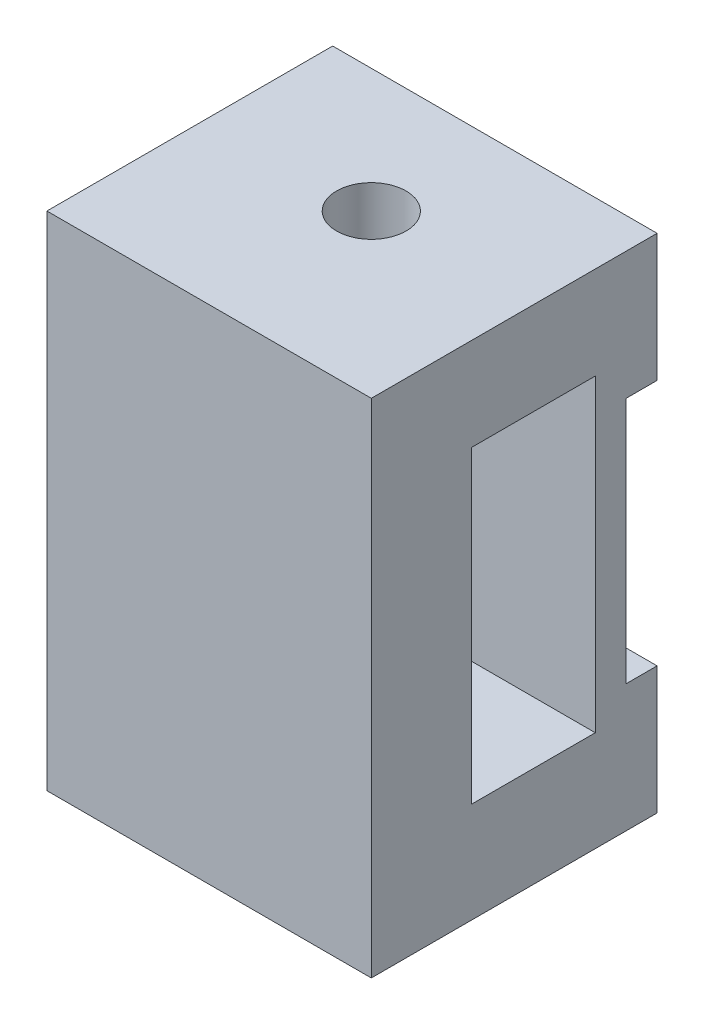
ISO-10303-21;
HEADER;
FILE_DESCRIPTION(('STEP AP214'),'2;1');
FILE_NAME('part.step','',(''),(''),'','','');
FILE_SCHEMA(('AUTOMOTIVE_DESIGN { 1 0 10303 214 1 1 1 1 }'));
ENDSEC;
DATA;
#1=APPLICATION_CONTEXT('core data for automotive mechanical design processes');
#2=APPLICATION_PROTOCOL_DEFINITION('international standard','automotive_design',2000,#1);
#3=PRODUCT_CONTEXT('',#1,'mechanical');
#4=PRODUCT('Part','Part','',(#3));
#5=PRODUCT_RELATED_PRODUCT_CATEGORY('part','',(#4));
#6=PRODUCT_DEFINITION_FORMATION('','',#4);
#7=PRODUCT_DEFINITION_CONTEXT('part definition',#1,'design');
#8=PRODUCT_DEFINITION('design','',#6,#7);
#9=PRODUCT_DEFINITION_SHAPE('','',#8);
#10=(LENGTH_UNIT() NAMED_UNIT(*) SI_UNIT(.MILLI.,.METRE.));
#11=(NAMED_UNIT(*) PLANE_ANGLE_UNIT() SI_UNIT($,.RADIAN.));
#12=(NAMED_UNIT(*) SI_UNIT($,.STERADIAN.) SOLID_ANGLE_UNIT());
#13=UNCERTAINTY_MEASURE_WITH_UNIT(LENGTH_MEASURE(1.E-05),#10,'distance_accuracy_value','');
#14=(GEOMETRIC_REPRESENTATION_CONTEXT(3) GLOBAL_UNCERTAINTY_ASSIGNED_CONTEXT((#13)) GLOBAL_UNIT_ASSIGNED_CONTEXT((#10,
#11,#12)) REPRESENTATION_CONTEXT('',''));
#15=CARTESIAN_POINT('',(0.,0.,0.));
#16=DIRECTION('',(0.,0.,1.));
#17=DIRECTION('',(1.,0.,0.));
#18=AXIS2_PLACEMENT_3D('',#15,#16,#17);
#19=CARTESIAN_POINT('',(-21.,-53.,-16.));
#20=DIRECTION('',(0.,0.,1.));
#21=DIRECTION('',(1.,0.,0.));
#22=AXIS2_PLACEMENT_3D('',#19,#20,#21);
#23=PLANE('',#22);
#24=DIRECTION('',(1.,0.,0.));
#25=VECTOR('',#24,1.);
#26=CARTESIAN_POINT('',(-21.,-36.5,-15.9999999999998));
#27=LINE('',#26,#25);
#28=CARTESIAN_POINT('',(-21.,-36.5,-15.9999999999998));
#29=VERTEX_POINT('',#28);
#30=CARTESIAN_POINT('',(21.,-36.5,-16.));
#31=VERTEX_POINT('',#30);
#32=EDGE_CURVE('E159',#29,#31,#27,.T.);
#33=ORIENTED_EDGE('',*,*,#32,.T.);
#34=DIRECTION('',(0.,1.,0.));
#35=VECTOR('',#34,1.);
#36=CARTESIAN_POINT('',(21.,-53.,-16.));
#37=LINE('',#36,#35);
#38=CARTESIAN_POINT('',(21.,-53.,-16.));
#39=VERTEX_POINT('',#38);
#40=EDGE_CURVE('E58',#39,#31,#37,.T.);
#41=ORIENTED_EDGE('',*,*,#40,.F.);
#42=DIRECTION('',(1.,0.,0.));
#43=VECTOR('',#42,1.);
#44=CARTESIAN_POINT('',(-21.,-53.,-16.));
#45=LINE('',#44,#43);
#46=CARTESIAN_POINT('',(-21.,-53.,-16.));
#47=VERTEX_POINT('',#46);
#48=EDGE_CURVE('E162',#47,#39,#45,.T.);
#49=ORIENTED_EDGE('',*,*,#48,.F.);
#50=DIRECTION('',(0.,1.,0.));
#51=VECTOR('',#50,1.);
#52=CARTESIAN_POINT('',(-21.,-53.,-16.));
#53=LINE('',#52,#51);
#54=EDGE_CURVE('E169',#47,#29,#53,.T.);
#55=ORIENTED_EDGE('',*,*,#54,.T.);
#56=EDGE_LOOP('',(#33,#41,#49,#55));
#57=FACE_BOUND('',#56,.T.);
#58=ADVANCED_FACE('F36',(#57),#23,.F.);
#59=CARTESIAN_POINT('',(0.,0.,0.));
#60=DIRECTION('',(0.,1.,0.));
#61=DIRECTION('',(0.,0.,1.));
#62=AXIS2_PLACEMENT_3D('',#59,#60,#61);
#63=PLANE('',#62);
#64=CARTESIAN_POINT('',(0.,0.,0.));
#65=DIRECTION('',(0.,1.,0.));
#66=DIRECTION('',(0.,0.,1.));
#67=AXIS2_PLACEMENT_3D('',#64,#65,#66);
#68=CIRCLE('',#67,4.5);
#69=CARTESIAN_POINT('',(0.,0.,4.5));
#70=VERTEX_POINT('',#69);
#71=EDGE_CURVE('E180',#70,#70,#68,.T.);
#72=ORIENTED_EDGE('',*,*,#71,.T.);
#73=EDGE_LOOP('',(#72));
#74=FACE_BOUND('',#73,.T.);
#75=DIRECTION('',(1.,0.,0.));
#76=VECTOR('',#75,1.);
#77=CARTESIAN_POINT('',(-21.,0.,8.));
#78=LINE('',#77,#76);
#79=CARTESIAN_POINT('',(-21.,0.,8.));
#80=VERTEX_POINT('',#79);
#81=CARTESIAN_POINT('',(21.,0.,8.));
#82=VERTEX_POINT('',#81);
#83=EDGE_CURVE('E203',#80,#82,#78,.T.);
#84=ORIENTED_EDGE('',*,*,#83,.F.);
#85=DIRECTION('',(0.,0.,1.));
#86=VECTOR('',#85,1.);
#87=CARTESIAN_POINT('',(-21.,0.,-21.));
#88=LINE('',#87,#86);
#89=CARTESIAN_POINT('',(-21.,0.,-8.));
#90=VERTEX_POINT('',#89);
#91=EDGE_CURVE('E224',#90,#80,#88,.T.);
#92=ORIENTED_EDGE('',*,*,#91,.F.);
#93=DIRECTION('',(-1.,0.,0.));
#94=VECTOR('',#93,1.);
#95=CARTESIAN_POINT('',(-21.,0.,-8.));
#96=LINE('',#95,#94);
#97=CARTESIAN_POINT('',(21.,0.,-8.));
#98=VERTEX_POINT('',#97);
#99=EDGE_CURVE('E205',#98,#90,#96,.T.);
#100=ORIENTED_EDGE('',*,*,#99,.F.);
#101=DIRECTION('',(0.,0.,-1.));
#102=VECTOR('',#101,1.);
#103=CARTESIAN_POINT('',(21.,0.,-21.));
#104=LINE('',#103,#102);
#105=EDGE_CURVE('E219',#82,#98,#104,.T.);
#106=ORIENTED_EDGE('',*,*,#105,.F.);
#107=EDGE_LOOP('',(#84,#92,#100,#106));
#108=FACE_BOUND('',#107,.T.);
#109=ADVANCED_FACE('F265',(#74,#108),#63,.F.);
#110=CARTESIAN_POINT('',(21.,12.,-21.));
#111=DIRECTION('',(-1.,0.,0.));
#112=DIRECTION('',(0.,0.,1.));
#113=AXIS2_PLACEMENT_3D('',#110,#111,#112);
#114=PLANE('',#113);
#115=DIRECTION('',(0.,1.,0.));
#116=VECTOR('',#115,1.);
#117=CARTESIAN_POINT('',(21.,-36.5,-12.));
#118=LINE('',#117,#116);
#119=CARTESIAN_POINT('',(21.,-36.5,-12.));
#120=VERTEX_POINT('',#119);
#121=CARTESIAN_POINT('',(21.,-4.5,-12.));
#122=VERTEX_POINT('',#121);
#123=EDGE_CURVE('E150',#120,#122,#118,.T.);
#124=ORIENTED_EDGE('',*,*,#123,.T.);
#125=DIRECTION('',(0.,0.,1.));
#126=VECTOR('',#125,1.);
#127=CARTESIAN_POINT('',(21.,-4.5,-16.));
#128=LINE('',#127,#126);
#129=CARTESIAN_POINT('',(21.,-4.5,-16.));
#130=VERTEX_POINT('',#129);
#131=EDGE_CURVE('E141',#130,#122,#128,.T.);
#132=ORIENTED_EDGE('',*,*,#131,.F.);
#133=CARTESIAN_POINT('',(21.,12.,-16.));
#134=VERTEX_POINT('',#133);
#135=EDGE_CURVE('E168',#130,#134,#37,.T.);
#136=ORIENTED_EDGE('',*,*,#135,.T.);
#137=DIRECTION('',(0.,0.,-1.));
#138=VECTOR('',#137,1.);
#139=CARTESIAN_POINT('',(21.,12.,-21.));
#140=LINE('',#139,#138);
#141=CARTESIAN_POINT('',(21.,12.,21.));
#142=VERTEX_POINT('',#141);
#143=EDGE_CURVE('E220',#142,#134,#140,.T.);
#144=ORIENTED_EDGE('',*,*,#143,.F.);
#145=DIRECTION('',(0.,-1.,0.));
#146=VECTOR('',#145,1.);
#147=CARTESIAN_POINT('',(21.,12.,21.));
#148=LINE('',#147,#146);
#149=CARTESIAN_POINT('',(21.,-53.,21.));
#150=VERTEX_POINT('',#149);
#151=EDGE_CURVE('E44',#142,#150,#148,.T.);
#152=ORIENTED_EDGE('',*,*,#151,.T.);
#153=DIRECTION('',(0.,0.,1.));
#154=VECTOR('',#153,1.);
#155=CARTESIAN_POINT('',(21.,-53.,21.));
#156=LINE('',#155,#154);
#157=EDGE_CURVE('E187',#39,#150,#156,.T.);
#158=ORIENTED_EDGE('',*,*,#157,.F.);
#159=ORIENTED_EDGE('',*,*,#40,.T.);
#160=DIRECTION('',(0.,0.,1.));
#161=VECTOR('',#160,1.);
#162=CARTESIAN_POINT('',(21.,-36.5,-15.9999999999998));
#163=LINE('',#162,#161);
#164=EDGE_CURVE('E51',#31,#120,#163,.T.);
#165=ORIENTED_EDGE('',*,*,#164,.T.);
#166=EDGE_LOOP('',(#124,#132,#136,#144,#152,#158,#159,#165));
#167=FACE_BOUND('',#166,.T.);
#168=DIRECTION('',(0.,1.,0.));
#169=VECTOR('',#168,1.);
#170=CARTESIAN_POINT('',(21.,-40.,-8.));
#171=LINE('',#170,#169);
#172=CARTESIAN_POINT('',(21.,-40.,-7.99999999999999));
#173=VERTEX_POINT('',#172);
#174=EDGE_CURVE('E216',#173,#98,#171,.T.);
#175=ORIENTED_EDGE('',*,*,#174,.F.);
#176=DIRECTION('',(0.,0.,1.));
#177=VECTOR('',#176,1.);
#178=CARTESIAN_POINT('',(21.,-40.,21.));
#179=LINE('',#178,#177);
#180=CARTESIAN_POINT('',(21.,-40.,8.));
#181=VERTEX_POINT('',#180);
#182=EDGE_CURVE('E188',#173,#181,#179,.T.);
#183=ORIENTED_EDGE('',*,*,#182,.T.);
#184=DIRECTION('',(0.,1.,0.));
#185=VECTOR('',#184,1.);
#186=CARTESIAN_POINT('',(21.,-40.,8.));
#187=LINE('',#186,#185);
#188=EDGE_CURVE('E199',#181,#82,#187,.T.);
#189=ORIENTED_EDGE('',*,*,#188,.T.);
#190=ORIENTED_EDGE('',*,*,#105,.T.);
#191=EDGE_LOOP('',(#175,#183,#189,#190));
#192=FACE_BOUND('',#191,.T.);
#193=ADVANCED_FACE('F38',(#167,#192),#114,.F.);
#194=CARTESIAN_POINT('',(-21.,12.,-21.));
#195=DIRECTION('',(1.,0.,0.));
#196=DIRECTION('',(0.,0.,-1.));
#197=AXIS2_PLACEMENT_3D('',#194,#195,#196);
#198=PLANE('',#197);
#199=CARTESIAN_POINT('',(-21.,-4.5,-16.));
#200=VERTEX_POINT('',#199);
#201=CARTESIAN_POINT('',(-21.,12.,-16.));
#202=VERTEX_POINT('',#201);
#203=EDGE_CURVE('E148',#200,#202,#53,.T.);
#204=ORIENTED_EDGE('',*,*,#203,.F.);
#205=DIRECTION('',(0.,0.,1.));
#206=VECTOR('',#205,1.);
#207=CARTESIAN_POINT('',(-21.,-4.5,-16.));
#208=LINE('',#207,#206);
#209=CARTESIAN_POINT('',(-21.,-4.5,-12.));
#210=VERTEX_POINT('',#209);
#211=EDGE_CURVE('E135',#200,#210,#208,.T.);
#212=ORIENTED_EDGE('',*,*,#211,.T.);
#213=DIRECTION('',(0.,1.,0.));
#214=VECTOR('',#213,1.);
#215=CARTESIAN_POINT('',(-21.,-36.5,-12.));
#216=LINE('',#215,#214);
#217=CARTESIAN_POINT('',(-21.,-36.5,-12.));
#218=VERTEX_POINT('',#217);
#219=EDGE_CURVE('E124',#218,#210,#216,.T.);
#220=ORIENTED_EDGE('',*,*,#219,.F.);
#221=DIRECTION('',(0.,0.,1.));
#222=VECTOR('',#221,1.);
#223=CARTESIAN_POINT('',(-21.,-36.5,-15.9999999999998));
#224=LINE('',#223,#222);
#225=EDGE_CURVE('E134',#29,#218,#224,.T.);
#226=ORIENTED_EDGE('',*,*,#225,.F.);
#227=ORIENTED_EDGE('',*,*,#54,.F.);
#228=DIRECTION('',(0.,0.,-1.));
#229=VECTOR('',#228,1.);
#230=CARTESIAN_POINT('',(-21.,-53.,21.));
#231=LINE('',#230,#229);
#232=CARTESIAN_POINT('',(-21.,-53.,21.));
#233=VERTEX_POINT('',#232);
#234=EDGE_CURVE('E184',#233,#47,#231,.T.);
#235=ORIENTED_EDGE('',*,*,#234,.F.);
#236=DIRECTION('',(0.,-1.,0.));
#237=VECTOR('',#236,1.);
#238=CARTESIAN_POINT('',(-21.,12.,21.));
#239=LINE('',#238,#237);
#240=CARTESIAN_POINT('',(-21.,12.,21.));
#241=VERTEX_POINT('',#240);
#242=EDGE_CURVE('E11',#241,#233,#239,.T.);
#243=ORIENTED_EDGE('',*,*,#242,.F.);
#244=DIRECTION('',(0.,0.,1.));
#245=VECTOR('',#244,1.);
#246=CARTESIAN_POINT('',(-21.,12.,-21.));
#247=LINE('',#246,#245);
#248=EDGE_CURVE('E223',#202,#241,#247,.T.);
#249=ORIENTED_EDGE('',*,*,#248,.F.);
#250=EDGE_LOOP('',(#204,#212,#220,#226,#227,#235,#243,#249));
#251=FACE_BOUND('',#250,.T.);
#252=DIRECTION('',(0.,0.,-1.));
#253=VECTOR('',#252,1.);
#254=CARTESIAN_POINT('',(-21.,-40.,21.));
#255=LINE('',#254,#253);
#256=CARTESIAN_POINT('',(-21.,-40.,8.));
#257=VERTEX_POINT('',#256);
#258=CARTESIAN_POINT('',(-21.,-40.,-8.));
#259=VERTEX_POINT('',#258);
#260=EDGE_CURVE('E183',#257,#259,#255,.T.);
#261=ORIENTED_EDGE('',*,*,#260,.T.);
#262=DIRECTION('',(0.,1.,0.));
#263=VECTOR('',#262,1.);
#264=CARTESIAN_POINT('',(-21.,-40.,-8.));
#265=LINE('',#264,#263);
#266=EDGE_CURVE('E211',#259,#90,#265,.T.);
#267=ORIENTED_EDGE('',*,*,#266,.T.);
#268=ORIENTED_EDGE('',*,*,#91,.T.);
#269=DIRECTION('',(0.,1.,0.));
#270=VECTOR('',#269,1.);
#271=CARTESIAN_POINT('',(-21.,-40.,8.));
#272=LINE('',#271,#270);
#273=EDGE_CURVE('E193',#257,#80,#272,.T.);
#274=ORIENTED_EDGE('',*,*,#273,.F.);
#275=EDGE_LOOP('',(#261,#267,#268,#274));
#276=FACE_BOUND('',#275,.T.);
#277=ADVANCED_FACE('F145',(#251,#276),#198,.F.);
#278=CARTESIAN_POINT('',(-21.,12.,21.));
#279=DIRECTION('',(0.,0.,-1.));
#280=DIRECTION('',(-1.,0.,0.));
#281=AXIS2_PLACEMENT_3D('',#278,#279,#280);
#282=PLANE('',#281);
#283=ORIENTED_EDGE('',*,*,#242,.T.);
#284=DIRECTION('',(-1.,0.,0.));
#285=VECTOR('',#284,1.);
#286=CARTESIAN_POINT('',(-21.,-53.,21.));
#287=LINE('',#286,#285);
#288=EDGE_CURVE('E190',#150,#233,#287,.T.);
#289=ORIENTED_EDGE('',*,*,#288,.F.);
#290=ORIENTED_EDGE('',*,*,#151,.F.);
#291=DIRECTION('',(1.,0.,0.));
#292=VECTOR('',#291,1.);
#293=CARTESIAN_POINT('',(-21.,12.,21.));
#294=LINE('',#293,#292);
#295=EDGE_CURVE('E226',#241,#142,#294,.T.);
#296=ORIENTED_EDGE('',*,*,#295,.F.);
#297=EDGE_LOOP('',(#283,#289,#290,#296));
#298=FACE_BOUND('',#297,.T.);
#299=ADVANCED_FACE('F239',(#298),#282,.F.);
#300=CARTESIAN_POINT('',(0.,12.,0.));
#301=DIRECTION('',(0.,1.,0.));
#302=DIRECTION('',(0.,0.,1.));
#303=AXIS2_PLACEMENT_3D('',#300,#301,#302);
#304=PLANE('',#303);
#305=DIRECTION('',(1.,0.,0.));
#306=VECTOR('',#305,1.);
#307=CARTESIAN_POINT('',(-21.,12.,-16.));
#308=LINE('',#307,#306);
#309=EDGE_CURVE('E158',#202,#134,#308,.T.);
#310=ORIENTED_EDGE('',*,*,#309,.F.);
#311=ORIENTED_EDGE('',*,*,#248,.T.);
#312=ORIENTED_EDGE('',*,*,#295,.T.);
#313=ORIENTED_EDGE('',*,*,#143,.T.);
#314=EDGE_LOOP('',(#310,#311,#312,#313));
#315=FACE_BOUND('',#314,.T.);
#316=CARTESIAN_POINT('',(0.,12.,0.));
#317=DIRECTION('',(0.,1.,0.));
#318=DIRECTION('',(0.,0.,1.));
#319=AXIS2_PLACEMENT_3D('',#316,#317,#318);
#320=CIRCLE('',#319,4.5);
#321=CARTESIAN_POINT('',(0.,12.,4.5));
#322=VERTEX_POINT('',#321);
#323=EDGE_CURVE('E167',#322,#322,#320,.T.);
#324=ORIENTED_EDGE('',*,*,#323,.F.);
#325=EDGE_LOOP('',(#324));
#326=FACE_BOUND('',#325,.T.);
#327=ADVANCED_FACE('F251',(#315,#326),#304,.T.);
#328=CARTESIAN_POINT('',(-21.,-40.,-8.));
#329=DIRECTION('',(0.,0.,-1.));
#330=DIRECTION('',(-1.,0.,0.));
#331=AXIS2_PLACEMENT_3D('',#328,#329,#330);
#332=PLANE('',#331);
#333=ORIENTED_EDGE('',*,*,#99,.T.);
#334=ORIENTED_EDGE('',*,*,#266,.F.);
#335=DIRECTION('',(-1.,0.,0.));
#336=VECTOR('',#335,1.);
#337=CARTESIAN_POINT('',(-21.,-40.,-8.));
#338=LINE('',#337,#336);
#339=EDGE_CURVE('E208',#173,#259,#338,.T.);
#340=ORIENTED_EDGE('',*,*,#339,.F.);
#341=ORIENTED_EDGE('',*,*,#174,.T.);
#342=EDGE_LOOP('',(#333,#334,#340,#341));
#343=FACE_BOUND('',#342,.T.);
#344=ADVANCED_FACE('F254',(#343),#332,.F.);
#345=CARTESIAN_POINT('',(-21.,-40.,8.));
#346=DIRECTION('',(0.,0.,1.));
#347=DIRECTION('',(1.,0.,0.));
#348=AXIS2_PLACEMENT_3D('',#345,#346,#347);
#349=PLANE('',#348);
#350=ORIENTED_EDGE('',*,*,#83,.T.);
#351=ORIENTED_EDGE('',*,*,#188,.F.);
#352=DIRECTION('',(1.,0.,0.));
#353=VECTOR('',#352,1.);
#354=CARTESIAN_POINT('',(-21.,-40.,8.));
#355=LINE('',#354,#353);
#356=EDGE_CURVE('E202',#257,#181,#355,.T.);
#357=ORIENTED_EDGE('',*,*,#356,.F.);
#358=ORIENTED_EDGE('',*,*,#273,.T.);
#359=EDGE_LOOP('',(#350,#351,#357,#358));
#360=FACE_BOUND('',#359,.T.);
#361=ADVANCED_FACE('F280',(#360),#349,.F.);
#362=CARTESIAN_POINT('',(0.,-40.,0.));
#363=DIRECTION('',(0.,-1.,0.));
#364=DIRECTION('',(0.,0.,-1.));
#365=AXIS2_PLACEMENT_3D('',#362,#363,#364);
#366=PLANE('',#365);
#367=CARTESIAN_POINT('',(0.,-40.,0.));
#368=DIRECTION('',(0.,-1.,0.));
#369=DIRECTION('',(0.,0.,-1.));
#370=AXIS2_PLACEMENT_3D('',#367,#368,#369);
#371=CIRCLE('',#370,4.5);
#372=CARTESIAN_POINT('',(0.,-40.,-4.5));
#373=VERTEX_POINT('',#372);
#374=EDGE_CURVE('E175',#373,#373,#371,.T.);
#375=ORIENTED_EDGE('',*,*,#374,.T.);
#376=EDGE_LOOP('',(#375));
#377=FACE_BOUND('',#376,.T.);
#378=ORIENTED_EDGE('',*,*,#182,.F.);
#379=ORIENTED_EDGE('',*,*,#339,.T.);
#380=ORIENTED_EDGE('',*,*,#260,.F.);
#381=ORIENTED_EDGE('',*,*,#356,.T.);
#382=EDGE_LOOP('',(#378,#379,#380,#381));
#383=FACE_BOUND('',#382,.T.);
#384=ADVANCED_FACE('F279',(#377,#383),#366,.F.);
#385=CARTESIAN_POINT('',(0.,-53.,0.));
#386=DIRECTION('',(0.,-1.,0.));
#387=DIRECTION('',(0.,0.,-1.));
#388=AXIS2_PLACEMENT_3D('',#385,#386,#387);
#389=PLANE('',#388);
#390=ORIENTED_EDGE('',*,*,#48,.T.);
#391=ORIENTED_EDGE('',*,*,#157,.T.);
#392=ORIENTED_EDGE('',*,*,#288,.T.);
#393=ORIENTED_EDGE('',*,*,#234,.T.);
#394=EDGE_LOOP('',(#390,#391,#392,#393));
#395=FACE_BOUND('',#394,.T.);
#396=CARTESIAN_POINT('',(0.,-53.,0.));
#397=DIRECTION('',(0.,1.,0.));
#398=DIRECTION('',(0.,0.,1.));
#399=AXIS2_PLACEMENT_3D('',#396,#397,#398);
#400=CIRCLE('',#399,4.5);
#401=CARTESIAN_POINT('',(0.,-53.,4.5));
#402=VERTEX_POINT('',#401);
#403=EDGE_CURVE('E172',#402,#402,#400,.T.);
#404=ORIENTED_EDGE('',*,*,#403,.T.);
#405=EDGE_LOOP('',(#404));
#406=FACE_BOUND('',#405,.T.);
#407=ADVANCED_FACE('F243',(#395,#406),#389,.T.);
#408=CARTESIAN_POINT('',(0.,-53.,0.));
#409=DIRECTION('',(0.,1.,0.));
#410=DIRECTION('',(0.,0.,1.));
#411=AXIS2_PLACEMENT_3D('',#408,#409,#410);
#412=CYLINDRICAL_SURFACE('',#411,4.5);
#413=ORIENTED_EDGE('',*,*,#403,.F.);
#414=EDGE_LOOP('',(#413));
#415=FACE_BOUND('',#414,.T.);
#416=ORIENTED_EDGE('',*,*,#374,.F.);
#417=EDGE_LOOP('',(#416));
#418=FACE_BOUND('',#417,.T.);
#419=ADVANCED_FACE('F261',(#415,#418),#412,.F.);
#420=ORIENTED_EDGE('',*,*,#323,.T.);
#421=EDGE_LOOP('',(#420));
#422=FACE_BOUND('',#421,.T.);
#423=ORIENTED_EDGE('',*,*,#71,.F.);
#424=EDGE_LOOP('',(#423));
#425=FACE_BOUND('',#424,.T.);
#426=ADVANCED_FACE('F258',(#422,#425),#412,.F.);
#427=ORIENTED_EDGE('',*,*,#135,.F.);
#428=DIRECTION('',(1.,0.,0.));
#429=VECTOR('',#428,1.);
#430=CARTESIAN_POINT('',(-21.,-4.5,-16.));
#431=LINE('',#430,#429);
#432=EDGE_CURVE('E156',#200,#130,#431,.T.);
#433=ORIENTED_EDGE('',*,*,#432,.F.);
#434=ORIENTED_EDGE('',*,*,#203,.T.);
#435=ORIENTED_EDGE('',*,*,#309,.T.);
#436=EDGE_LOOP('',(#427,#433,#434,#435));
#437=FACE_BOUND('',#436,.T.);
#438=ADVANCED_FACE('F248',(#437),#23,.F.);
#439=CARTESIAN_POINT('',(-21.,-4.5,-16.));
#440=DIRECTION('',(0.,1.,0.));
#441=DIRECTION('',(0.,0.,1.));
#442=AXIS2_PLACEMENT_3D('',#439,#440,#441);
#443=PLANE('',#442);
#444=ORIENTED_EDGE('',*,*,#131,.T.);
#445=DIRECTION('',(1.,0.,0.));
#446=VECTOR('',#445,1.);
#447=CARTESIAN_POINT('',(-21.,-4.5,-12.));
#448=LINE('',#447,#446);
#449=EDGE_CURVE('E128',#210,#122,#448,.T.);
#450=ORIENTED_EDGE('',*,*,#449,.F.);
#451=ORIENTED_EDGE('',*,*,#211,.F.);
#452=ORIENTED_EDGE('',*,*,#432,.T.);
#453=EDGE_LOOP('',(#444,#450,#451,#452));
#454=FACE_BOUND('',#453,.T.);
#455=ADVANCED_FACE('F138',(#454),#443,.F.);
#456=CARTESIAN_POINT('',(-21.,-36.5,-15.9999999999998));
#457=DIRECTION('',(0.,1.,0.));
#458=DIRECTION('',(0.,0.,1.));
#459=AXIS2_PLACEMENT_3D('',#456,#457,#458);
#460=PLANE('',#459);
#461=ORIENTED_EDGE('',*,*,#164,.F.);
#462=ORIENTED_EDGE('',*,*,#32,.F.);
#463=ORIENTED_EDGE('',*,*,#225,.T.);
#464=DIRECTION('',(1.,0.,0.));
#465=VECTOR('',#464,1.);
#466=CARTESIAN_POINT('',(-21.,-36.5,-12.));
#467=LINE('',#466,#465);
#468=EDGE_CURVE('E130',#218,#120,#467,.T.);
#469=ORIENTED_EDGE('',*,*,#468,.T.);
#470=EDGE_LOOP('',(#461,#462,#463,#469));
#471=FACE_BOUND('',#470,.T.);
#472=ADVANCED_FACE('F299',(#471),#460,.T.);
#473=CARTESIAN_POINT('',(-21.,-36.5,-12.));
#474=DIRECTION('',(0.,0.,-1.));
#475=DIRECTION('',(-1.,0.,0.));
#476=AXIS2_PLACEMENT_3D('',#473,#474,#475);
#477=PLANE('',#476);
#478=ORIENTED_EDGE('',*,*,#123,.F.);
#479=ORIENTED_EDGE('',*,*,#468,.F.);
#480=ORIENTED_EDGE('',*,*,#219,.T.);
#481=ORIENTED_EDGE('',*,*,#449,.T.);
#482=EDGE_LOOP('',(#478,#479,#480,#481));
#483=FACE_BOUND('',#482,.T.);
#484=ADVANCED_FACE('F127',(#483),#477,.T.);
#485=CLOSED_SHELL('',(#58,#109,#193,#277,#299,#327,#344,#361,#384,#407,#419,#426,#438,#455,#472,#484));
#486=MANIFOLD_SOLID_BREP('B2',#485);
#487=ADVANCED_BREP_SHAPE_REPRESENTATION('',(#18,#486),#14);
#488=SHAPE_DEFINITION_REPRESENTATION(#9,#487);
ENDSEC;
END-ISO-10303-21;
